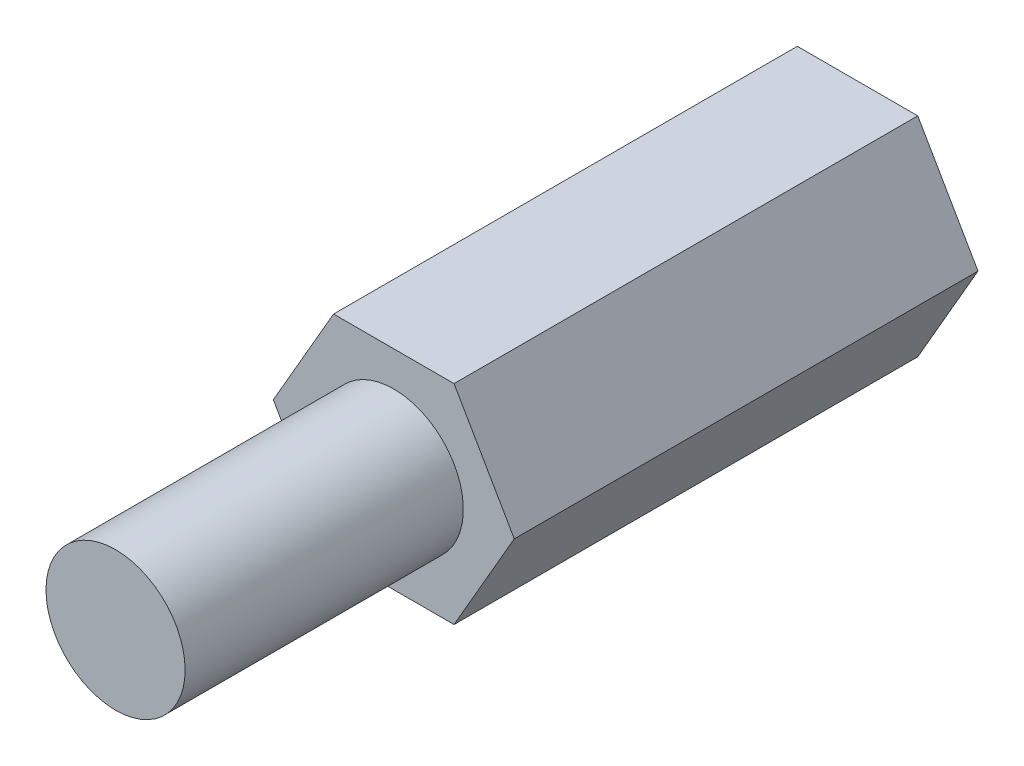
ISO-10303-21;
HEADER;
FILE_DESCRIPTION(('STEP AP214'),'2;1');
FILE_NAME('part.step','',(''),(''),'','','');
FILE_SCHEMA(('AUTOMOTIVE_DESIGN { 1 0 10303 214 1 1 1 1 }'));
ENDSEC;
DATA;
#1=APPLICATION_CONTEXT('core data for automotive mechanical design processes');
#2=APPLICATION_PROTOCOL_DEFINITION('international standard','automotive_design',2000,#1);
#3=PRODUCT_CONTEXT('',#1,'mechanical');
#4=PRODUCT('Part','Part','',(#3));
#5=PRODUCT_RELATED_PRODUCT_CATEGORY('part','',(#4));
#6=PRODUCT_DEFINITION_FORMATION('','',#4);
#7=PRODUCT_DEFINITION_CONTEXT('part definition',#1,'design');
#8=PRODUCT_DEFINITION('design','',#6,#7);
#9=PRODUCT_DEFINITION_SHAPE('','',#8);
#10=(LENGTH_UNIT() NAMED_UNIT(*) SI_UNIT(.MILLI.,.METRE.));
#11=(NAMED_UNIT(*) PLANE_ANGLE_UNIT() SI_UNIT($,.RADIAN.));
#12=(NAMED_UNIT(*) SI_UNIT($,.STERADIAN.) SOLID_ANGLE_UNIT());
#13=UNCERTAINTY_MEASURE_WITH_UNIT(LENGTH_MEASURE(1.E-05),#10,'distance_accuracy_value','');
#14=(GEOMETRIC_REPRESENTATION_CONTEXT(3) GLOBAL_UNCERTAINTY_ASSIGNED_CONTEXT((#13)) GLOBAL_UNIT_ASSIGNED_CONTEXT((#10,
#11,#12)) REPRESENTATION_CONTEXT('',''));
#15=CARTESIAN_POINT('',(0.,0.,0.));
#16=DIRECTION('',(0.,0.,1.));
#17=DIRECTION('',(1.,0.,0.));
#18=AXIS2_PLACEMENT_3D('',#15,#16,#17);
#19=CARTESIAN_POINT('',(0.,0.,6.));
#20=DIRECTION('',(0.,0.,-1.));
#21=DIRECTION('',(-1.,0.,0.));
#22=AXIS2_PLACEMENT_3D('',#19,#20,#21);
#23=CYLINDRICAL_SURFACE('',#22,1.5);
#24=CARTESIAN_POINT('',(0.,0.,6.));
#25=DIRECTION('',(0.,0.,1.));
#26=DIRECTION('',(1.,0.,0.));
#27=AXIS2_PLACEMENT_3D('',#24,#25,#26);
#28=CIRCLE('',#27,1.5);
#29=CARTESIAN_POINT('',(1.5,0.,6.));
#30=VERTEX_POINT('',#29);
#31=EDGE_CURVE('E11',#30,#30,#28,.T.);
#32=ORIENTED_EDGE('',*,*,#31,.F.);
#33=EDGE_LOOP('',(#32));
#34=FACE_BOUND('',#33,.T.);
#35=CARTESIAN_POINT('',(0.,0.,0.));
#36=DIRECTION('',(0.,0.,-1.));
#37=DIRECTION('',(-1.,0.,0.));
#38=AXIS2_PLACEMENT_3D('',#35,#36,#37);
#39=CIRCLE('',#38,1.5);
#40=CARTESIAN_POINT('',(-1.5,0.,0.));
#41=VERTEX_POINT('',#40);
#42=EDGE_CURVE('E47',#41,#41,#39,.T.);
#43=ORIENTED_EDGE('',*,*,#42,.F.);
#44=EDGE_LOOP('',(#43));
#45=FACE_BOUND('',#44,.T.);
#46=ADVANCED_FACE('F39',(#34,#45),#23,.T.);
#47=CARTESIAN_POINT('',(0.,0.,6.));
#48=DIRECTION('',(0.,0.,1.));
#49=DIRECTION('',(1.,0.,0.));
#50=AXIS2_PLACEMENT_3D('',#47,#48,#49);
#51=PLANE('',#50);
#52=ORIENTED_EDGE('',*,*,#31,.T.);
#53=EDGE_LOOP('',(#52));
#54=FACE_BOUND('',#53,.T.);
#55=ADVANCED_FACE('F149',(#54),#51,.T.);
#56=CARTESIAN_POINT('',(0.,0.,0.));
#57=DIRECTION('',(0.,0.,-1.));
#58=DIRECTION('',(-1.,0.,0.));
#59=AXIS2_PLACEMENT_3D('',#56,#57,#58);
#60=PLANE('',#59);
#61=DIRECTION('',(0.5,0.866025403784438,0.));
#62=VECTOR('',#61,1.);
#63=CARTESIAN_POINT('',(-2.59807621135332,0.,0.));
#64=LINE('',#63,#62);
#65=CARTESIAN_POINT('',(-2.59807621135332,0.,0.));
#66=VERTEX_POINT('',#65);
#67=CARTESIAN_POINT('',(-1.29903810567666,2.25,0.));
#68=VERTEX_POINT('',#67);
#69=EDGE_CURVE('E124',#66,#68,#64,.T.);
#70=ORIENTED_EDGE('',*,*,#69,.F.);
#71=DIRECTION('',(-0.5,0.866025403784439,0.));
#72=VECTOR('',#71,1.);
#73=CARTESIAN_POINT('',(-1.29903810567666,-2.25,0.));
#74=LINE('',#73,#72);
#75=CARTESIAN_POINT('',(-1.29903810567666,-2.25,0.));
#76=VERTEX_POINT('',#75);
#77=EDGE_CURVE('E84',#76,#66,#74,.T.);
#78=ORIENTED_EDGE('',*,*,#77,.F.);
#79=DIRECTION('',(-1.,0.,0.));
#80=VECTOR('',#79,1.);
#81=CARTESIAN_POINT('',(1.29903810567666,-2.25,0.));
#82=LINE('',#81,#80);
#83=CARTESIAN_POINT('',(1.29903810567666,-2.25,0.));
#84=VERTEX_POINT('',#83);
#85=EDGE_CURVE('E78',#84,#76,#82,.T.);
#86=ORIENTED_EDGE('',*,*,#85,.F.);
#87=DIRECTION('',(-0.5,-0.866025403784439,0.));
#88=VECTOR('',#87,1.);
#89=CARTESIAN_POINT('',(2.59807621135331,0.,0.));
#90=LINE('',#89,#88);
#91=CARTESIAN_POINT('',(2.59807621135331,0.,0.));
#92=VERTEX_POINT('',#91);
#93=EDGE_CURVE('E114',#92,#84,#90,.T.);
#94=ORIENTED_EDGE('',*,*,#93,.F.);
#95=DIRECTION('',(0.5,-0.866025403784439,0.));
#96=VECTOR('',#95,1.);
#97=CARTESIAN_POINT('',(1.29903810567666,2.25,0.));
#98=LINE('',#97,#96);
#99=CARTESIAN_POINT('',(1.29903810567666,2.25,0.));
#100=VERTEX_POINT('',#99);
#101=EDGE_CURVE('E130',#100,#92,#98,.T.);
#102=ORIENTED_EDGE('',*,*,#101,.F.);
#103=DIRECTION('',(1.,0.,0.));
#104=VECTOR('',#103,1.);
#105=CARTESIAN_POINT('',(-1.29903810567666,2.25,0.));
#106=LINE('',#105,#104);
#107=EDGE_CURVE('E127',#68,#100,#106,.T.);
#108=ORIENTED_EDGE('',*,*,#107,.F.);
#109=EDGE_LOOP('',(#70,#78,#86,#94,#102,#108));
#110=FACE_BOUND('',#109,.T.);
#111=ORIENTED_EDGE('',*,*,#42,.T.);
#112=EDGE_LOOP('',(#111));
#113=FACE_BOUND('',#112,.T.);
#114=ADVANCED_FACE('F146',(#110,#113),#60,.F.);
#115=CARTESIAN_POINT('',(-2.59807621135332,0.,-10.));
#116=DIRECTION('',(0.866025403784438,-0.5,0.));
#117=DIRECTION('',(0.5,0.866025403784439,0.));
#118=AXIS2_PLACEMENT_3D('',#115,#116,#117);
#119=PLANE('',#118);
#120=ORIENTED_EDGE('',*,*,#69,.T.);
#121=DIRECTION('',(0.,0.,1.));
#122=VECTOR('',#121,1.);
#123=CARTESIAN_POINT('',(-1.29903810567666,2.25,-10.));
#124=LINE('',#123,#122);
#125=CARTESIAN_POINT('',(-1.29903810567666,2.25,-10.));
#126=VERTEX_POINT('',#125);
#127=EDGE_CURVE('E142',#126,#68,#124,.T.);
#128=ORIENTED_EDGE('',*,*,#127,.F.);
#129=DIRECTION('',(0.5,0.866025403784438,0.));
#130=VECTOR('',#129,1.);
#131=CARTESIAN_POINT('',(-2.59807621135332,0.,-10.));
#132=LINE('',#131,#130);
#133=CARTESIAN_POINT('',(-2.59807621135332,0.,-10.));
#134=VERTEX_POINT('',#133);
#135=EDGE_CURVE('E135',#134,#126,#132,.T.);
#136=ORIENTED_EDGE('',*,*,#135,.F.);
#137=DIRECTION('',(0.,0.,1.));
#138=VECTOR('',#137,1.);
#139=CARTESIAN_POINT('',(-2.59807621135332,0.,-10.));
#140=LINE('',#139,#138);
#141=EDGE_CURVE('E120',#134,#66,#140,.T.);
#142=ORIENTED_EDGE('',*,*,#141,.T.);
#143=EDGE_LOOP('',(#120,#128,#136,#142));
#144=FACE_BOUND('',#143,.T.);
#145=ADVANCED_FACE('F159',(#144),#119,.F.);
#146=CARTESIAN_POINT('',(-1.29903810567666,2.25,-10.));
#147=DIRECTION('',(0.,-1.,0.));
#148=DIRECTION('',(0.,0.,-1.));
#149=AXIS2_PLACEMENT_3D('',#146,#147,#148);
#150=PLANE('',#149);
#151=ORIENTED_EDGE('',*,*,#107,.T.);
#152=DIRECTION('',(0.,0.,1.));
#153=VECTOR('',#152,1.);
#154=CARTESIAN_POINT('',(1.29903810567666,2.25,-10.));
#155=LINE('',#154,#153);
#156=CARTESIAN_POINT('',(1.29903810567666,2.25,-10.));
#157=VERTEX_POINT('',#156);
#158=EDGE_CURVE('E139',#157,#100,#155,.T.);
#159=ORIENTED_EDGE('',*,*,#158,.F.);
#160=DIRECTION('',(1.,0.,0.));
#161=VECTOR('',#160,1.);
#162=CARTESIAN_POINT('',(-1.29903810567666,2.25,-10.));
#163=LINE('',#162,#161);
#164=EDGE_CURVE('E93',#126,#157,#163,.T.);
#165=ORIENTED_EDGE('',*,*,#164,.F.);
#166=ORIENTED_EDGE('',*,*,#127,.T.);
#167=EDGE_LOOP('',(#151,#159,#165,#166));
#168=FACE_BOUND('',#167,.T.);
#169=ADVANCED_FACE('F165',(#168),#150,.F.);
#170=CARTESIAN_POINT('',(1.29903810567666,2.25,-10.));
#171=DIRECTION('',(-0.866025403784439,-0.5,0.));
#172=DIRECTION('',(0.5,-0.866025403784439,0.));
#173=AXIS2_PLACEMENT_3D('',#170,#171,#172);
#174=PLANE('',#173);
#175=ORIENTED_EDGE('',*,*,#101,.T.);
#176=DIRECTION('',(0.,0.,1.));
#177=VECTOR('',#176,1.);
#178=CARTESIAN_POINT('',(2.59807621135331,0.,-10.));
#179=LINE('',#178,#177);
#180=CARTESIAN_POINT('',(2.59807621135331,0.,-10.));
#181=VERTEX_POINT('',#180);
#182=EDGE_CURVE('E115',#181,#92,#179,.T.);
#183=ORIENTED_EDGE('',*,*,#182,.F.);
#184=DIRECTION('',(0.5,-0.866025403784439,0.));
#185=VECTOR('',#184,1.);
#186=CARTESIAN_POINT('',(1.29903810567666,2.25,-10.));
#187=LINE('',#186,#185);
#188=EDGE_CURVE('E106',#157,#181,#187,.T.);
#189=ORIENTED_EDGE('',*,*,#188,.F.);
#190=ORIENTED_EDGE('',*,*,#158,.T.);
#191=EDGE_LOOP('',(#175,#183,#189,#190));
#192=FACE_BOUND('',#191,.T.);
#193=ADVANCED_FACE('F169',(#192),#174,.F.);
#194=CARTESIAN_POINT('',(2.59807621135331,0.,-10.));
#195=DIRECTION('',(-0.866025403784439,0.5,0.));
#196=DIRECTION('',(-0.5,-0.866025403784439,0.));
#197=AXIS2_PLACEMENT_3D('',#194,#195,#196);
#198=PLANE('',#197);
#199=ORIENTED_EDGE('',*,*,#93,.T.);
#200=DIRECTION('',(0.,0.,1.));
#201=VECTOR('',#200,1.);
#202=CARTESIAN_POINT('',(1.29903810567666,-2.25,-10.));
#203=LINE('',#202,#201);
#204=CARTESIAN_POINT('',(1.29903810567666,-2.25,-10.));
#205=VERTEX_POINT('',#204);
#206=EDGE_CURVE('E111',#205,#84,#203,.T.);
#207=ORIENTED_EDGE('',*,*,#206,.F.);
#208=DIRECTION('',(-0.5,-0.866025403784439,0.));
#209=VECTOR('',#208,1.);
#210=CARTESIAN_POINT('',(2.59807621135331,0.,-10.));
#211=LINE('',#210,#209);
#212=EDGE_CURVE('E100',#181,#205,#211,.T.);
#213=ORIENTED_EDGE('',*,*,#212,.F.);
#214=ORIENTED_EDGE('',*,*,#182,.T.);
#215=EDGE_LOOP('',(#199,#207,#213,#214));
#216=FACE_BOUND('',#215,.T.);
#217=ADVANCED_FACE('F112',(#216),#198,.F.);
#218=CARTESIAN_POINT('',(1.29903810567666,-2.25,-10.));
#219=DIRECTION('',(0.,1.,0.));
#220=DIRECTION('',(-1.,0.,0.));
#221=AXIS2_PLACEMENT_3D('',#218,#219,#220);
#222=PLANE('',#221);
#223=ORIENTED_EDGE('',*,*,#85,.T.);
#224=DIRECTION('',(0.,0.,1.));
#225=VECTOR('',#224,1.);
#226=CARTESIAN_POINT('',(-1.29903810567666,-2.25,-10.));
#227=LINE('',#226,#225);
#228=CARTESIAN_POINT('',(-1.29903810567666,-2.25,-10.));
#229=VERTEX_POINT('',#228);
#230=EDGE_CURVE('E116',#229,#76,#227,.T.);
#231=ORIENTED_EDGE('',*,*,#230,.F.);
#232=DIRECTION('',(-1.,0.,0.));
#233=VECTOR('',#232,1.);
#234=CARTESIAN_POINT('',(1.29903810567666,-2.25,-10.));
#235=LINE('',#234,#233);
#236=EDGE_CURVE('E104',#205,#229,#235,.T.);
#237=ORIENTED_EDGE('',*,*,#236,.F.);
#238=ORIENTED_EDGE('',*,*,#206,.T.);
#239=EDGE_LOOP('',(#223,#231,#237,#238));
#240=FACE_BOUND('',#239,.T.);
#241=ADVANCED_FACE('F118',(#240),#222,.F.);
#242=CARTESIAN_POINT('',(-1.29903810567666,-2.25,-10.));
#243=DIRECTION('',(0.866025403784439,0.5,0.));
#244=DIRECTION('',(-0.5,0.866025403784439,0.));
#245=AXIS2_PLACEMENT_3D('',#242,#243,#244);
#246=PLANE('',#245);
#247=ORIENTED_EDGE('',*,*,#77,.T.);
#248=ORIENTED_EDGE('',*,*,#141,.F.);
#249=DIRECTION('',(-0.5,0.866025403784439,0.));
#250=VECTOR('',#249,1.);
#251=CARTESIAN_POINT('',(-1.29903810567666,-2.25,-10.));
#252=LINE('',#251,#250);
#253=EDGE_CURVE('E55',#229,#134,#252,.T.);
#254=ORIENTED_EDGE('',*,*,#253,.F.);
#255=ORIENTED_EDGE('',*,*,#230,.T.);
#256=EDGE_LOOP('',(#247,#248,#254,#255));
#257=FACE_BOUND('',#256,.T.);
#258=ADVANCED_FACE('F177',(#257),#246,.F.);
#259=CARTESIAN_POINT('',(0.,0.,-10.));
#260=DIRECTION('',(0.,0.,-1.));
#261=DIRECTION('',(-1.,0.,0.));
#262=AXIS2_PLACEMENT_3D('',#259,#260,#261);
#263=PLANE('',#262);
#264=CARTESIAN_POINT('',(0.,0.,-10.));
#265=DIRECTION('',(0.,0.,-1.));
#266=DIRECTION('',(-1.,0.,0.));
#267=AXIS2_PLACEMENT_3D('',#264,#265,#266);
#268=CIRCLE('',#267,1.5);
#269=CARTESIAN_POINT('',(-1.5,0.,-10.));
#270=VERTEX_POINT('',#269);
#271=EDGE_CURVE('E194',#270,#270,#268,.T.);
#272=ORIENTED_EDGE('',*,*,#271,.F.);
#273=EDGE_LOOP('',(#272));
#274=FACE_BOUND('',#273,.T.);
#275=ORIENTED_EDGE('',*,*,#135,.T.);
#276=ORIENTED_EDGE('',*,*,#164,.T.);
#277=ORIENTED_EDGE('',*,*,#188,.T.);
#278=ORIENTED_EDGE('',*,*,#212,.T.);
#279=ORIENTED_EDGE('',*,*,#236,.T.);
#280=ORIENTED_EDGE('',*,*,#253,.T.);
#281=EDGE_LOOP('',(#275,#276,#277,#278,#279,#280));
#282=FACE_BOUND('',#281,.T.);
#283=ADVANCED_FACE('F102',(#274,#282),#263,.T.);
#284=CARTESIAN_POINT('',(0.,0.,-4.));
#285=DIRECTION('',(0.,0.,-1.));
#286=DIRECTION('',(-1.,0.,0.));
#287=AXIS2_PLACEMENT_3D('',#284,#285,#286);
#288=CYLINDRICAL_SURFACE('',#287,1.5);
#289=CARTESIAN_POINT('',(0.,0.,-4.));
#290=DIRECTION('',(0.,0.,-1.));
#291=DIRECTION('',(-1.,0.,0.));
#292=AXIS2_PLACEMENT_3D('',#289,#290,#291);
#293=CIRCLE('',#292,1.5);
#294=CARTESIAN_POINT('',(-1.5,0.,-4.));
#295=VERTEX_POINT('',#294);
#296=EDGE_CURVE('E128',#295,#295,#293,.T.);
#297=ORIENTED_EDGE('',*,*,#296,.F.);
#298=EDGE_LOOP('',(#297));
#299=FACE_BOUND('',#298,.T.);
#300=ORIENTED_EDGE('',*,*,#271,.T.);
#301=EDGE_LOOP('',(#300));
#302=FACE_BOUND('',#301,.T.);
#303=ADVANCED_FACE('F182',(#299,#302),#288,.F.);
#304=CARTESIAN_POINT('',(0.,0.,-4.));
#305=DIRECTION('',(0.,0.,-1.));
#306=DIRECTION('',(-1.,0.,0.));
#307=AXIS2_PLACEMENT_3D('',#304,#305,#306);
#308=PLANE('',#307);
#309=ORIENTED_EDGE('',*,*,#296,.T.);
#310=EDGE_LOOP('',(#309));
#311=FACE_BOUND('',#310,.T.);
#312=ADVANCED_FACE('F186',(#311),#308,.T.);
#313=CLOSED_SHELL('',(#46,#55,#114,#145,#169,#193,#217,#241,#258,#283,#303,#312));
#314=MANIFOLD_SOLID_BREP('B2',#313);
#315=ADVANCED_BREP_SHAPE_REPRESENTATION('',(#18,#314),#14);
#316=SHAPE_DEFINITION_REPRESENTATION(#9,#315);
ENDSEC;
END-ISO-10303-21;
